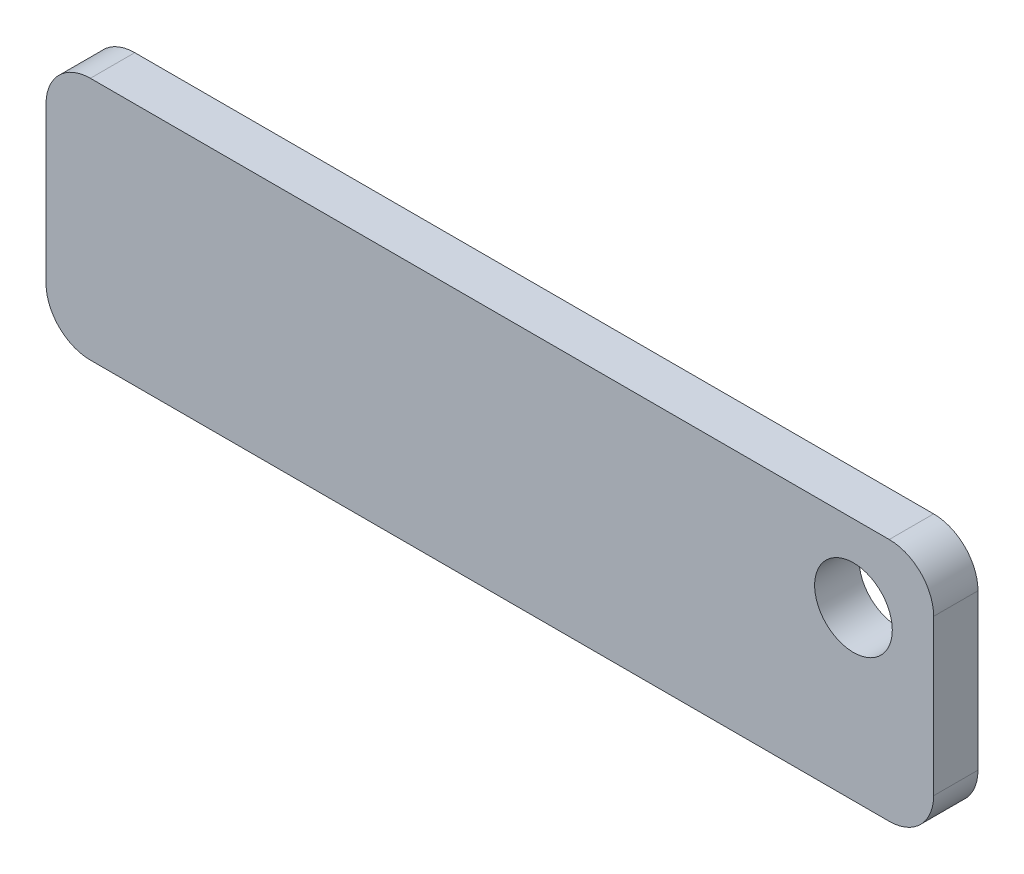
ISO-10303-21;
HEADER;
FILE_DESCRIPTION(('STEP AP214'),'2;1');
FILE_NAME('part.step','',(''),(''),'','','');
FILE_SCHEMA(('AUTOMOTIVE_DESIGN { 1 0 10303 214 1 1 1 1 }'));
ENDSEC;
DATA;
#1=APPLICATION_CONTEXT('core data for automotive mechanical design processes');
#2=APPLICATION_PROTOCOL_DEFINITION('international standard','automotive_design',2000,#1);
#3=PRODUCT_CONTEXT('',#1,'mechanical');
#4=PRODUCT('Part','Part','',(#3));
#5=PRODUCT_RELATED_PRODUCT_CATEGORY('part','',(#4));
#6=PRODUCT_DEFINITION_FORMATION('','',#4);
#7=PRODUCT_DEFINITION_CONTEXT('part definition',#1,'design');
#8=PRODUCT_DEFINITION('design','',#6,#7);
#9=PRODUCT_DEFINITION_SHAPE('','',#8);
#10=(LENGTH_UNIT() NAMED_UNIT(*) SI_UNIT(.MILLI.,.METRE.));
#11=(NAMED_UNIT(*) PLANE_ANGLE_UNIT() SI_UNIT($,.RADIAN.));
#12=(NAMED_UNIT(*) SI_UNIT($,.STERADIAN.) SOLID_ANGLE_UNIT());
#13=UNCERTAINTY_MEASURE_WITH_UNIT(LENGTH_MEASURE(1.E-05),#10,'distance_accuracy_value','');
#14=(GEOMETRIC_REPRESENTATION_CONTEXT(3) GLOBAL_UNCERTAINTY_ASSIGNED_CONTEXT((#13)) GLOBAL_UNIT_ASSIGNED_CONTEXT((#10,
#11,#12)) REPRESENTATION_CONTEXT('',''));
#15=CARTESIAN_POINT('',(0.,0.,0.));
#16=DIRECTION('',(0.,0.,1.));
#17=DIRECTION('',(1.,0.,0.));
#18=AXIS2_PLACEMENT_3D('',#15,#16,#17);
#19=CARTESIAN_POINT('',(18.,3.5,2.));
#20=DIRECTION('',(0.,0.,-1.));
#21=DIRECTION('',(-1.,0.,0.));
#22=AXIS2_PLACEMENT_3D('',#19,#20,#21);
#23=CYLINDRICAL_SURFACE('',#22,2.);
#24=CARTESIAN_POINT('',(18.,3.5,0.));
#25=DIRECTION('',(0.,0.,1.));
#26=DIRECTION('',(-1.,0.,0.));
#27=AXIS2_PLACEMENT_3D('',#24,#25,#26);
#28=CIRCLE('',#27,2.);
#29=CARTESIAN_POINT('',(20.,3.5,0.));
#30=VERTEX_POINT('',#29);
#31=CARTESIAN_POINT('',(18.,5.5,0.));
#32=VERTEX_POINT('',#31);
#33=EDGE_CURVE('E135',#30,#32,#28,.T.);
#34=ORIENTED_EDGE('',*,*,#33,.T.);
#35=DIRECTION('',(0.,0.,-1.));
#36=VECTOR('',#35,1.);
#37=CARTESIAN_POINT('',(18.,5.5,2.));
#38=LINE('',#37,#36);
#39=CARTESIAN_POINT('',(18.,5.5,2.));
#40=VERTEX_POINT('',#39);
#41=EDGE_CURVE('E11',#40,#32,#38,.T.);
#42=ORIENTED_EDGE('',*,*,#41,.F.);
#43=CARTESIAN_POINT('',(18.,3.5,2.));
#44=DIRECTION('',(0.,0.,1.));
#45=DIRECTION('',(-1.,0.,0.));
#46=AXIS2_PLACEMENT_3D('',#43,#44,#45);
#47=CIRCLE('',#46,2.);
#48=CARTESIAN_POINT('',(20.,3.5,2.));
#49=VERTEX_POINT('',#48);
#50=EDGE_CURVE('E150',#49,#40,#47,.T.);
#51=ORIENTED_EDGE('',*,*,#50,.F.);
#52=DIRECTION('',(0.,0.,-1.));
#53=VECTOR('',#52,1.);
#54=CARTESIAN_POINT('',(20.,3.5,2.));
#55=LINE('',#54,#53);
#56=EDGE_CURVE('E131',#49,#30,#55,.T.);
#57=ORIENTED_EDGE('',*,*,#56,.T.);
#58=EDGE_LOOP('',(#34,#42,#51,#57));
#59=FACE_BOUND('',#58,.T.);
#60=ADVANCED_FACE('F39',(#59),#23,.T.);
#61=CARTESIAN_POINT('',(-18.,5.5,2.));
#62=DIRECTION('',(0.,-1.,0.));
#63=DIRECTION('',(0.,0.,-1.));
#64=AXIS2_PLACEMENT_3D('',#61,#62,#63);
#65=PLANE('',#64);
#66=DIRECTION('',(-1.,0.,0.));
#67=VECTOR('',#66,1.);
#68=CARTESIAN_POINT('',(-18.,5.5,0.));
#69=LINE('',#68,#67);
#70=CARTESIAN_POINT('',(-18.,5.5,0.));
#71=VERTEX_POINT('',#70);
#72=EDGE_CURVE('E138',#32,#71,#69,.T.);
#73=ORIENTED_EDGE('',*,*,#72,.T.);
#74=DIRECTION('',(0.,0.,-1.));
#75=VECTOR('',#74,1.);
#76=CARTESIAN_POINT('',(-18.,5.5,2.));
#77=LINE('',#76,#75);
#78=CARTESIAN_POINT('',(-18.,5.5,2.));
#79=VERTEX_POINT('',#78);
#80=EDGE_CURVE('E47',#79,#71,#77,.T.);
#81=ORIENTED_EDGE('',*,*,#80,.F.);
#82=DIRECTION('',(-1.,0.,0.));
#83=VECTOR('',#82,1.);
#84=CARTESIAN_POINT('',(-18.,5.5,2.));
#85=LINE('',#84,#83);
#86=EDGE_CURVE('E98',#40,#79,#85,.T.);
#87=ORIENTED_EDGE('',*,*,#86,.F.);
#88=ORIENTED_EDGE('',*,*,#41,.T.);
#89=EDGE_LOOP('',(#73,#81,#87,#88));
#90=FACE_BOUND('',#89,.T.);
#91=ADVANCED_FACE('F206',(#90),#65,.F.);
#92=CARTESIAN_POINT('',(-18.,3.5,2.));
#93=DIRECTION('',(0.,0.,-1.));
#94=DIRECTION('',(-1.,0.,0.));
#95=AXIS2_PLACEMENT_3D('',#92,#93,#94);
#96=CYLINDRICAL_SURFACE('',#95,2.);
#97=CARTESIAN_POINT('',(-18.,3.5,0.));
#98=DIRECTION('',(0.,0.,1.));
#99=DIRECTION('',(1.,0.,0.));
#100=AXIS2_PLACEMENT_3D('',#97,#98,#99);
#101=CIRCLE('',#100,2.);
#102=CARTESIAN_POINT('',(-20.,3.5,0.));
#103=VERTEX_POINT('',#102);
#104=EDGE_CURVE('E141',#71,#103,#101,.T.);
#105=ORIENTED_EDGE('',*,*,#104,.T.);
#106=DIRECTION('',(0.,0.,-1.));
#107=VECTOR('',#106,1.);
#108=CARTESIAN_POINT('',(-20.,3.5,2.));
#109=LINE('',#108,#107);
#110=CARTESIAN_POINT('',(-20.,3.5,2.));
#111=VERTEX_POINT('',#110);
#112=EDGE_CURVE('E157',#111,#103,#109,.T.);
#113=ORIENTED_EDGE('',*,*,#112,.F.);
#114=CARTESIAN_POINT('',(-18.,3.5,2.));
#115=DIRECTION('',(0.,0.,1.));
#116=DIRECTION('',(1.,0.,0.));
#117=AXIS2_PLACEMENT_3D('',#114,#115,#116);
#118=CIRCLE('',#117,2.);
#119=EDGE_CURVE('E165',#79,#111,#118,.T.);
#120=ORIENTED_EDGE('',*,*,#119,.F.);
#121=ORIENTED_EDGE('',*,*,#80,.T.);
#122=EDGE_LOOP('',(#105,#113,#120,#121));
#123=FACE_BOUND('',#122,.T.);
#124=ADVANCED_FACE('F163',(#123),#96,.T.);
#125=CARTESIAN_POINT('',(-20.,3.5,2.));
#126=DIRECTION('',(1.,0.,0.));
#127=DIRECTION('',(0.,1.,0.));
#128=AXIS2_PLACEMENT_3D('',#125,#126,#127);
#129=PLANE('',#128);
#130=DIRECTION('',(0.,-1.,0.));
#131=VECTOR('',#130,1.);
#132=CARTESIAN_POINT('',(-20.,3.5,0.));
#133=LINE('',#132,#131);
#134=CARTESIAN_POINT('',(-20.,-3.5,0.));
#135=VERTEX_POINT('',#134);
#136=EDGE_CURVE('E143',#103,#135,#133,.T.);
#137=ORIENTED_EDGE('',*,*,#136,.T.);
#138=DIRECTION('',(0.,0.,-1.));
#139=VECTOR('',#138,1.);
#140=CARTESIAN_POINT('',(-20.,-3.5,2.));
#141=LINE('',#140,#139);
#142=CARTESIAN_POINT('',(-20.,-3.5,2.));
#143=VERTEX_POINT('',#142);
#144=EDGE_CURVE('E154',#143,#135,#141,.T.);
#145=ORIENTED_EDGE('',*,*,#144,.F.);
#146=DIRECTION('',(0.,-1.,0.));
#147=VECTOR('',#146,1.);
#148=CARTESIAN_POINT('',(-20.,3.5,2.));
#149=LINE('',#148,#147);
#150=EDGE_CURVE('E177',#111,#143,#149,.T.);
#151=ORIENTED_EDGE('',*,*,#150,.F.);
#152=ORIENTED_EDGE('',*,*,#112,.T.);
#153=EDGE_LOOP('',(#137,#145,#151,#152));
#154=FACE_BOUND('',#153,.T.);
#155=ADVANCED_FACE('F173',(#154),#129,.F.);
#156=CARTESIAN_POINT('',(-18.,-3.5,2.));
#157=DIRECTION('',(0.,0.,-1.));
#158=DIRECTION('',(-1.,0.,0.));
#159=AXIS2_PLACEMENT_3D('',#156,#157,#158);
#160=CYLINDRICAL_SURFACE('',#159,2.);
#161=CARTESIAN_POINT('',(-18.,-3.5,0.));
#162=DIRECTION('',(0.,0.,1.));
#163=DIRECTION('',(1.,0.,0.));
#164=AXIS2_PLACEMENT_3D('',#161,#162,#163);
#165=CIRCLE('',#164,2.);
#166=CARTESIAN_POINT('',(-18.,-5.5,0.));
#167=VERTEX_POINT('',#166);
#168=EDGE_CURVE('E145',#135,#167,#165,.T.);
#169=ORIENTED_EDGE('',*,*,#168,.T.);
#170=DIRECTION('',(0.,0.,-1.));
#171=VECTOR('',#170,1.);
#172=CARTESIAN_POINT('',(-18.,-5.5,2.));
#173=LINE('',#172,#171);
#174=CARTESIAN_POINT('',(-18.,-5.5,2.));
#175=VERTEX_POINT('',#174);
#176=EDGE_CURVE('E126',#175,#167,#173,.T.);
#177=ORIENTED_EDGE('',*,*,#176,.F.);
#178=CARTESIAN_POINT('',(-18.,-3.5,2.));
#179=DIRECTION('',(0.,0.,1.));
#180=DIRECTION('',(1.,0.,0.));
#181=AXIS2_PLACEMENT_3D('',#178,#179,#180);
#182=CIRCLE('',#181,2.);
#183=EDGE_CURVE('E117',#143,#175,#182,.T.);
#184=ORIENTED_EDGE('',*,*,#183,.F.);
#185=ORIENTED_EDGE('',*,*,#144,.T.);
#186=EDGE_LOOP('',(#169,#177,#184,#185));
#187=FACE_BOUND('',#186,.T.);
#188=ADVANCED_FACE('F176',(#187),#160,.T.);
#189=CARTESIAN_POINT('',(-18.,-5.5,2.));
#190=DIRECTION('',(0.,1.,0.));
#191=DIRECTION('',(-1.,0.,0.));
#192=AXIS2_PLACEMENT_3D('',#189,#190,#191);
#193=PLANE('',#192);
#194=DIRECTION('',(1.,0.,0.));
#195=VECTOR('',#194,1.);
#196=CARTESIAN_POINT('',(-18.,-5.5,0.));
#197=LINE('',#196,#195);
#198=CARTESIAN_POINT('',(18.,-5.5,0.));
#199=VERTEX_POINT('',#198);
#200=EDGE_CURVE('E125',#167,#199,#197,.T.);
#201=ORIENTED_EDGE('',*,*,#200,.T.);
#202=DIRECTION('',(0.,0.,-1.));
#203=VECTOR('',#202,1.);
#204=CARTESIAN_POINT('',(18.,-5.5,2.));
#205=LINE('',#204,#203);
#206=CARTESIAN_POINT('',(18.,-5.5,2.));
#207=VERTEX_POINT('',#206);
#208=EDGE_CURVE('E122',#207,#199,#205,.T.);
#209=ORIENTED_EDGE('',*,*,#208,.F.);
#210=DIRECTION('',(1.,0.,0.));
#211=VECTOR('',#210,1.);
#212=CARTESIAN_POINT('',(-18.,-5.5,2.));
#213=LINE('',#212,#211);
#214=EDGE_CURVE('E111',#175,#207,#213,.T.);
#215=ORIENTED_EDGE('',*,*,#214,.F.);
#216=ORIENTED_EDGE('',*,*,#176,.T.);
#217=EDGE_LOOP('',(#201,#209,#215,#216));
#218=FACE_BOUND('',#217,.T.);
#219=ADVANCED_FACE('F123',(#218),#193,.F.);
#220=CARTESIAN_POINT('',(18.,-3.5,2.));
#221=DIRECTION('',(0.,0.,-1.));
#222=DIRECTION('',(-1.,0.,0.));
#223=AXIS2_PLACEMENT_3D('',#220,#221,#222);
#224=CYLINDRICAL_SURFACE('',#223,2.);
#225=CARTESIAN_POINT('',(18.,-3.5,0.));
#226=DIRECTION('',(0.,0.,1.));
#227=DIRECTION('',(1.,0.,0.));
#228=AXIS2_PLACEMENT_3D('',#225,#226,#227);
#229=CIRCLE('',#228,2.);
#230=CARTESIAN_POINT('',(20.,-3.5,0.));
#231=VERTEX_POINT('',#230);
#232=EDGE_CURVE('E84',#199,#231,#229,.T.);
#233=ORIENTED_EDGE('',*,*,#232,.T.);
#234=DIRECTION('',(0.,0.,-1.));
#235=VECTOR('',#234,1.);
#236=CARTESIAN_POINT('',(20.,-3.5,2.));
#237=LINE('',#236,#235);
#238=CARTESIAN_POINT('',(20.,-3.5,2.));
#239=VERTEX_POINT('',#238);
#240=EDGE_CURVE('E127',#239,#231,#237,.T.);
#241=ORIENTED_EDGE('',*,*,#240,.F.);
#242=CARTESIAN_POINT('',(18.,-3.5,2.));
#243=DIRECTION('',(0.,0.,1.));
#244=DIRECTION('',(1.,0.,0.));
#245=AXIS2_PLACEMENT_3D('',#242,#243,#244);
#246=CIRCLE('',#245,2.);
#247=EDGE_CURVE('E115',#207,#239,#246,.T.);
#248=ORIENTED_EDGE('',*,*,#247,.F.);
#249=ORIENTED_EDGE('',*,*,#208,.T.);
#250=EDGE_LOOP('',(#233,#241,#248,#249));
#251=FACE_BOUND('',#250,.T.);
#252=ADVANCED_FACE('F129',(#251),#224,.T.);
#253=CARTESIAN_POINT('',(20.,3.5,2.));
#254=DIRECTION('',(-1.,0.,0.));
#255=DIRECTION('',(0.,0.,1.));
#256=AXIS2_PLACEMENT_3D('',#253,#254,#255);
#257=PLANE('',#256);
#258=DIRECTION('',(0.,1.,0.));
#259=VECTOR('',#258,1.);
#260=CARTESIAN_POINT('',(20.,3.5,0.));
#261=LINE('',#260,#259);
#262=EDGE_CURVE('E90',#231,#30,#261,.T.);
#263=ORIENTED_EDGE('',*,*,#262,.T.);
#264=ORIENTED_EDGE('',*,*,#56,.F.);
#265=DIRECTION('',(0.,1.,0.));
#266=VECTOR('',#265,1.);
#267=CARTESIAN_POINT('',(20.,3.5,2.));
#268=LINE('',#267,#266);
#269=EDGE_CURVE('E55',#239,#49,#268,.T.);
#270=ORIENTED_EDGE('',*,*,#269,.F.);
#271=ORIENTED_EDGE('',*,*,#240,.T.);
#272=EDGE_LOOP('',(#263,#264,#270,#271));
#273=FACE_BOUND('',#272,.T.);
#274=ADVANCED_FACE('F197',(#273),#257,.F.);
#275=CARTESIAN_POINT('',(18.,3.5,2.));
#276=DIRECTION('',(0.,0.,-1.));
#277=DIRECTION('',(-1.,0.,0.));
#278=AXIS2_PLACEMENT_3D('',#275,#276,#277);
#279=PLANE('',#278);
#280=CARTESIAN_POINT('',(16.3879387163631,2.03401762401112,2.));
#281=DIRECTION('',(0.,0.,1.));
#282=DIRECTION('',(1.,0.,0.));
#283=AXIS2_PLACEMENT_3D('',#280,#281,#282);
#284=CIRCLE('',#283,1.75);
#285=CARTESIAN_POINT('',(18.1379387163631,2.03401762401112,2.));
#286=VERTEX_POINT('',#285);
#287=EDGE_CURVE('E183',#286,#286,#284,.T.);
#288=ORIENTED_EDGE('',*,*,#287,.F.);
#289=EDGE_LOOP('',(#288));
#290=FACE_BOUND('',#289,.T.);
#291=ORIENTED_EDGE('',*,*,#50,.T.);
#292=ORIENTED_EDGE('',*,*,#86,.T.);
#293=ORIENTED_EDGE('',*,*,#119,.T.);
#294=ORIENTED_EDGE('',*,*,#150,.T.);
#295=ORIENTED_EDGE('',*,*,#183,.T.);
#296=ORIENTED_EDGE('',*,*,#214,.T.);
#297=ORIENTED_EDGE('',*,*,#247,.T.);
#298=ORIENTED_EDGE('',*,*,#269,.T.);
#299=EDGE_LOOP('',(#291,#292,#293,#294,#295,#296,#297,#298));
#300=FACE_BOUND('',#299,.T.);
#301=ADVANCED_FACE('F113',(#290,#300),#279,.F.);
#302=CARTESIAN_POINT('',(18.,3.5,0.));
#303=DIRECTION('',(0.,0.,-1.));
#304=DIRECTION('',(-1.,0.,0.));
#305=AXIS2_PLACEMENT_3D('',#302,#303,#304);
#306=PLANE('',#305);
#307=CARTESIAN_POINT('',(16.3879387163631,2.03401762401112,0.));
#308=DIRECTION('',(0.,0.,1.));
#309=DIRECTION('',(1.,0.,0.));
#310=AXIS2_PLACEMENT_3D('',#307,#308,#309);
#311=CIRCLE('',#310,1.75);
#312=CARTESIAN_POINT('',(18.1379387163631,2.03401762401112,0.));
#313=VERTEX_POINT('',#312);
#314=EDGE_CURVE('E139',#313,#313,#311,.T.);
#315=ORIENTED_EDGE('',*,*,#314,.T.);
#316=EDGE_LOOP('',(#315));
#317=FACE_BOUND('',#316,.T.);
#318=ORIENTED_EDGE('',*,*,#33,.F.);
#319=ORIENTED_EDGE('',*,*,#262,.F.);
#320=ORIENTED_EDGE('',*,*,#232,.F.);
#321=ORIENTED_EDGE('',*,*,#200,.F.);
#322=ORIENTED_EDGE('',*,*,#168,.F.);
#323=ORIENTED_EDGE('',*,*,#136,.F.);
#324=ORIENTED_EDGE('',*,*,#104,.F.);
#325=ORIENTED_EDGE('',*,*,#72,.F.);
#326=EDGE_LOOP('',(#318,#319,#320,#321,#322,#323,#324,#325));
#327=FACE_BOUND('',#326,.T.);
#328=ADVANCED_FACE('F169',(#317,#327),#306,.T.);
#329=CARTESIAN_POINT('',(16.3879387163631,2.03401762401112,0.));
#330=DIRECTION('',(0.,0.,1.));
#331=DIRECTION('',(1.,0.,0.));
#332=AXIS2_PLACEMENT_3D('',#329,#330,#331);
#333=CYLINDRICAL_SURFACE('',#332,1.75);
#334=ORIENTED_EDGE('',*,*,#314,.F.);
#335=EDGE_LOOP('',(#334));
#336=FACE_BOUND('',#335,.T.);
#337=ORIENTED_EDGE('',*,*,#287,.T.);
#338=EDGE_LOOP('',(#337));
#339=FACE_BOUND('',#338,.T.);
#340=ADVANCED_FACE('F190',(#336,#339),#333,.F.);
#341=CLOSED_SHELL('',(#60,#91,#124,#155,#188,#219,#252,#274,#301,#328,#340));
#342=MANIFOLD_SOLID_BREP('B2',#341);
#343=ADVANCED_BREP_SHAPE_REPRESENTATION('',(#18,#342),#14);
#344=SHAPE_DEFINITION_REPRESENTATION(#9,#343);
ENDSEC;
END-ISO-10303-21;
